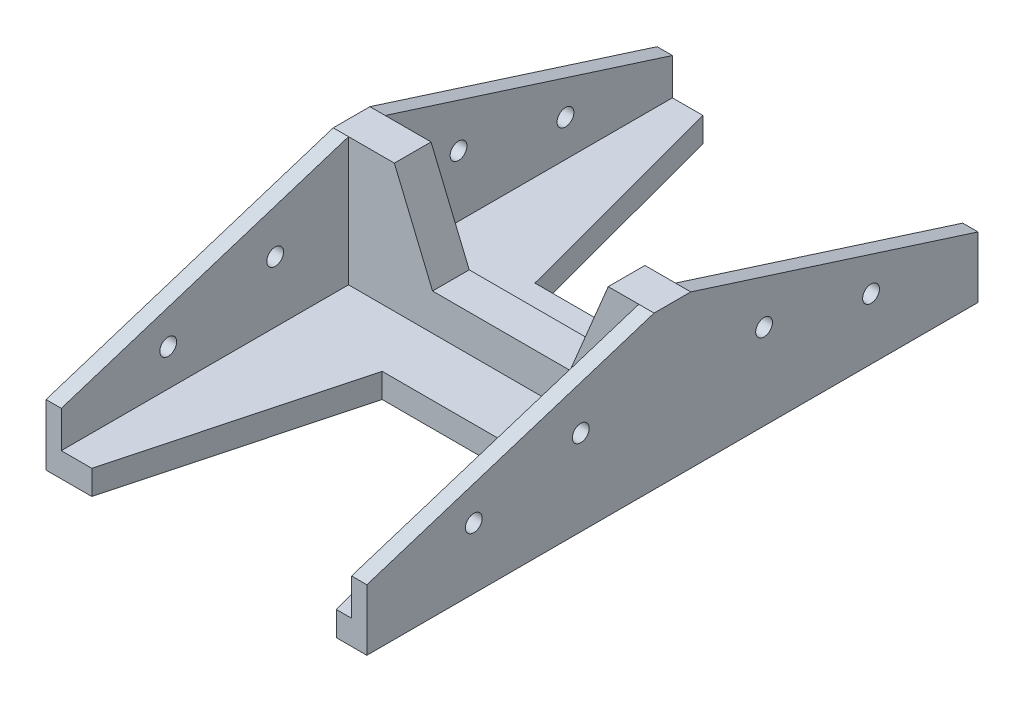
ISO-10303-21;
HEADER;
FILE_DESCRIPTION(('STEP AP214'),'2;1');
FILE_NAME('part.step','',(''),(''),'','','');
FILE_SCHEMA(('AUTOMOTIVE_DESIGN { 1 0 10303 214 1 1 1 1 }'));
ENDSEC;
DATA;
#1=APPLICATION_CONTEXT('core data for automotive mechanical design processes');
#2=APPLICATION_PROTOCOL_DEFINITION('international standard','automotive_design',2000,#1);
#3=PRODUCT_CONTEXT('',#1,'mechanical');
#4=PRODUCT('Part','Part','',(#3));
#5=PRODUCT_RELATED_PRODUCT_CATEGORY('part','',(#4));
#6=PRODUCT_DEFINITION_FORMATION('','',#4);
#7=PRODUCT_DEFINITION_CONTEXT('part definition',#1,'design');
#8=PRODUCT_DEFINITION('design','',#6,#7);
#9=PRODUCT_DEFINITION_SHAPE('','',#8);
#10=(LENGTH_UNIT() NAMED_UNIT(*) SI_UNIT(.MILLI.,.METRE.));
#11=(NAMED_UNIT(*) PLANE_ANGLE_UNIT() SI_UNIT($,.RADIAN.));
#12=(NAMED_UNIT(*) SI_UNIT($,.STERADIAN.) SOLID_ANGLE_UNIT());
#13=UNCERTAINTY_MEASURE_WITH_UNIT(LENGTH_MEASURE(1.E-05),#10,'distance_accuracy_value','');
#14=(GEOMETRIC_REPRESENTATION_CONTEXT(3) GLOBAL_UNCERTAINTY_ASSIGNED_CONTEXT((#13)) GLOBAL_UNIT_ASSIGNED_CONTEXT((#10,
#11,#12)) REPRESENTATION_CONTEXT('',''));
#15=CARTESIAN_POINT('',(0.,0.,0.));
#16=DIRECTION('',(0.,0.,1.));
#17=DIRECTION('',(1.,0.,0.));
#18=AXIS2_PLACEMENT_3D('',#15,#16,#17);
#19=CARTESIAN_POINT('',(5.,30.,6.));
#20=DIRECTION('',(0.,0.,-1.));
#21=DIRECTION('',(0.,1.,0.));
#22=AXIS2_PLACEMENT_3D('',#19,#20,#21);
#23=PLANE('',#22);
#24=DIRECTION('',(0.,1.,0.));
#25=VECTOR('',#24,1.);
#26=CARTESIAN_POINT('',(100.,-12.,6.00000000000001));
#27=LINE('',#26,#25);
#28=CARTESIAN_POINT('',(100.,-12.,6.00000000000001));
#29=VERTEX_POINT('',#28);
#30=CARTESIAN_POINT('',(100.,30.,6.));
#31=VERTEX_POINT('',#30);
#32=EDGE_CURVE('E217',#29,#31,#27,.T.);
#33=ORIENTED_EDGE('',*,*,#32,.T.);
#34=DIRECTION('',(-1.,0.,0.));
#35=VECTOR('',#34,1.);
#36=CARTESIAN_POINT('',(5.,30.,6.));
#37=LINE('',#36,#35);
#38=CARTESIAN_POINT('',(90.,30.,6.));
#39=VERTEX_POINT('',#38);
#40=EDGE_CURVE('E262',#31,#39,#37,.T.);
#41=ORIENTED_EDGE('',*,*,#40,.T.);
#42=DIRECTION('',(0.384615384615384,0.923076923076923,0.));
#43=VECTOR('',#42,1.);
#44=CARTESIAN_POINT('',(90.,30.,6.));
#45=LINE('',#44,#43);
#46=CARTESIAN_POINT('',(77.5,0.,6.));
#47=VERTEX_POINT('',#46);
#48=EDGE_CURVE('E347',#47,#39,#45,.T.);
#49=ORIENTED_EDGE('',*,*,#48,.F.);
#50=DIRECTION('',(1.,0.,0.));
#51=VECTOR('',#50,1.);
#52=CARTESIAN_POINT('',(32.5,0.,6.));
#53=LINE('',#52,#51);
#54=CARTESIAN_POINT('',(32.5,0.,6.));
#55=VERTEX_POINT('',#54);
#56=EDGE_CURVE('E344',#55,#47,#53,.T.);
#57=ORIENTED_EDGE('',*,*,#56,.F.);
#58=DIRECTION('',(0.384615384615385,-0.923076923076923,0.));
#59=VECTOR('',#58,1.);
#60=CARTESIAN_POINT('',(20.,30.,6.));
#61=LINE('',#60,#59);
#62=CARTESIAN_POINT('',(20.,30.,6.));
#63=VERTEX_POINT('',#62);
#64=EDGE_CURVE('E341',#63,#55,#61,.T.);
#65=ORIENTED_EDGE('',*,*,#64,.F.);
#66=CARTESIAN_POINT('',(5.,30.,6.));
#67=VERTEX_POINT('',#66);
#68=EDGE_CURVE('E258',#63,#67,#37,.T.);
#69=ORIENTED_EDGE('',*,*,#68,.T.);
#70=DIRECTION('',(0.,-1.,0.));
#71=VECTOR('',#70,1.);
#72=CARTESIAN_POINT('',(5.,-12.,6.00000000000001));
#73=LINE('',#72,#71);
#74=CARTESIAN_POINT('',(5.,-12.,6.00000000000001));
#75=VERTEX_POINT('',#74);
#76=EDGE_CURVE('E11',#67,#75,#73,.T.);
#77=ORIENTED_EDGE('',*,*,#76,.T.);
#78=DIRECTION('',(-1.,0.,0.));
#79=VECTOR('',#78,1.);
#80=CARTESIAN_POINT('',(105.,-12.,6.00000000000001));
#81=LINE('',#80,#79);
#82=EDGE_CURVE('E431',#29,#75,#81,.T.);
#83=ORIENTED_EDGE('',*,*,#82,.F.);
#84=EDGE_LOOP('',(#33,#41,#49,#57,#65,#69,#77,#83));
#85=FACE_BOUND('',#84,.T.);
#86=ADVANCED_FACE('F34',(#85),#23,.F.);
#87=CARTESIAN_POINT('',(105.,-12.,100.));
#88=DIRECTION('',(0.,-1.,0.));
#89=DIRECTION('',(0.,0.,-1.));
#90=AXIS2_PLACEMENT_3D('',#87,#88,#89);
#91=PLANE('',#90);
#92=DIRECTION('',(0.,0.,-1.));
#93=VECTOR('',#92,1.);
#94=CARTESIAN_POINT('',(100.,-12.,100.));
#95=LINE('',#94,#93);
#96=CARTESIAN_POINT('',(100.,-12.,100.));
#97=VERTEX_POINT('',#96);
#98=EDGE_CURVE('E210',#97,#29,#95,.T.);
#99=ORIENTED_EDGE('',*,*,#98,.T.);
#100=ORIENTED_EDGE('',*,*,#82,.T.);
#101=DIRECTION('',(0.,0.,1.));
#102=VECTOR('',#101,1.);
#103=CARTESIAN_POINT('',(5.,-12.,100.));
#104=LINE('',#103,#102);
#105=CARTESIAN_POINT('',(5.,-12.,100.));
#106=VERTEX_POINT('',#105);
#107=EDGE_CURVE('E419',#75,#106,#104,.T.);
#108=ORIENTED_EDGE('',*,*,#107,.T.);
#109=DIRECTION('',(-1.,0.,0.));
#110=VECTOR('',#109,1.);
#111=CARTESIAN_POINT('',(105.,-12.,100.));
#112=LINE('',#111,#110);
#113=CARTESIAN_POINT('',(15.,-12.,100.));
#114=VERTEX_POINT('',#113);
#115=EDGE_CURVE('E236',#114,#106,#112,.T.);
#116=ORIENTED_EDGE('',*,*,#115,.F.);
#117=DIRECTION('',(-0.257662650560332,0.,0.966234939601246));
#118=VECTOR('',#117,1.);
#119=CARTESIAN_POINT('',(15.,-12.,100.));
#120=LINE('',#119,#118);
#121=CARTESIAN_POINT('',(35.,-12.,25.));
#122=VERTEX_POINT('',#121);
#123=EDGE_CURVE('E392',#122,#114,#120,.T.);
#124=ORIENTED_EDGE('',*,*,#123,.F.);
#125=DIRECTION('',(-1.,0.,0.));
#126=VECTOR('',#125,1.);
#127=CARTESIAN_POINT('',(35.,-12.,25.));
#128=LINE('',#127,#126);
#129=CARTESIAN_POINT('',(75.,-12.,25.));
#130=VERTEX_POINT('',#129);
#131=EDGE_CURVE('E389',#130,#122,#128,.T.);
#132=ORIENTED_EDGE('',*,*,#131,.F.);
#133=DIRECTION('',(-0.257662650560332,0.,-0.966234939601246));
#134=VECTOR('',#133,1.);
#135=CARTESIAN_POINT('',(95.,-12.,100.));
#136=LINE('',#135,#134);
#137=CARTESIAN_POINT('',(95.,-12.,100.));
#138=VERTEX_POINT('',#137);
#139=EDGE_CURVE('E234',#138,#130,#136,.T.);
#140=ORIENTED_EDGE('',*,*,#139,.F.);
#141=EDGE_CURVE('E224',#97,#138,#112,.T.);
#142=ORIENTED_EDGE('',*,*,#141,.F.);
#143=EDGE_LOOP('',(#99,#100,#108,#116,#124,#132,#140,#142));
#144=FACE_BOUND('',#143,.T.);
#145=ADVANCED_FACE('F231',(#144),#91,.F.);
#146=CARTESIAN_POINT('',(5.,30.,-6.));
#147=DIRECTION('',(0.,0.,1.));
#148=DIRECTION('',(0.,-1.,0.));
#149=AXIS2_PLACEMENT_3D('',#146,#147,#148);
#150=PLANE('',#149);
#151=DIRECTION('',(0.,-1.,0.));
#152=VECTOR('',#151,1.);
#153=CARTESIAN_POINT('',(100.,30.,-6.));
#154=LINE('',#153,#152);
#155=CARTESIAN_POINT('',(100.,30.,-6.));
#156=VERTEX_POINT('',#155);
#157=CARTESIAN_POINT('',(100.,-12.,-6.));
#158=VERTEX_POINT('',#157);
#159=EDGE_CURVE('E312',#156,#158,#154,.T.);
#160=ORIENTED_EDGE('',*,*,#159,.T.);
#161=DIRECTION('',(-1.,0.,0.));
#162=VECTOR('',#161,1.);
#163=CARTESIAN_POINT('',(105.,-12.,-6.));
#164=LINE('',#163,#162);
#165=CARTESIAN_POINT('',(5.,-12.,-6.));
#166=VERTEX_POINT('',#165);
#167=EDGE_CURVE('E438',#158,#166,#164,.T.);
#168=ORIENTED_EDGE('',*,*,#167,.T.);
#169=DIRECTION('',(0.,1.,0.));
#170=VECTOR('',#169,1.);
#171=CARTESIAN_POINT('',(5.,30.,-6.));
#172=LINE('',#171,#170);
#173=CARTESIAN_POINT('',(5.,30.,-6.));
#174=VERTEX_POINT('',#173);
#175=EDGE_CURVE('E51',#166,#174,#172,.T.);
#176=ORIENTED_EDGE('',*,*,#175,.T.);
#177=DIRECTION('',(-1.,0.,0.));
#178=VECTOR('',#177,1.);
#179=CARTESIAN_POINT('',(5.,30.,-6.));
#180=LINE('',#179,#178);
#181=CARTESIAN_POINT('',(20.,30.,-5.99999999999999));
#182=VERTEX_POINT('',#181);
#183=EDGE_CURVE('E261',#182,#174,#180,.T.);
#184=ORIENTED_EDGE('',*,*,#183,.F.);
#185=DIRECTION('',(0.384615384615385,-0.923076923076923,0.));
#186=VECTOR('',#185,1.);
#187=CARTESIAN_POINT('',(17.7810650887574,35.3254437869822,-6.));
#188=LINE('',#187,#186);
#189=CARTESIAN_POINT('',(32.5,0.,-6.00000000000001));
#190=VERTEX_POINT('',#189);
#191=EDGE_CURVE('E354',#182,#190,#188,.T.);
#192=ORIENTED_EDGE('',*,*,#191,.T.);
#193=DIRECTION('',(1.,0.,0.));
#194=VECTOR('',#193,1.);
#195=CARTESIAN_POINT('',(5.,0.,-6.));
#196=LINE('',#195,#194);
#197=CARTESIAN_POINT('',(77.5,0.,-6.00000000000001));
#198=VERTEX_POINT('',#197);
#199=EDGE_CURVE('E362',#190,#198,#196,.T.);
#200=ORIENTED_EDGE('',*,*,#199,.T.);
#201=DIRECTION('',(0.384615384615384,0.923076923076923,0.));
#202=VECTOR('',#201,1.);
#203=CARTESIAN_POINT('',(77.4260355029586,-0.177514792899403,-6.));
#204=LINE('',#203,#202);
#205=CARTESIAN_POINT('',(90.,30.,-5.99999999999999));
#206=VERTEX_POINT('',#205);
#207=EDGE_CURVE('E365',#198,#206,#204,.T.);
#208=ORIENTED_EDGE('',*,*,#207,.T.);
#209=EDGE_CURVE('E267',#156,#206,#180,.T.);
#210=ORIENTED_EDGE('',*,*,#209,.F.);
#211=EDGE_LOOP('',(#160,#168,#176,#184,#192,#200,#208,#210));
#212=FACE_BOUND('',#211,.T.);
#213=ADVANCED_FACE('F514',(#212),#150,.F.);
#214=CARTESIAN_POINT('',(105.,-12.,-6.));
#215=DIRECTION('',(0.,-1.,0.));
#216=DIRECTION('',(0.,0.,-1.));
#217=AXIS2_PLACEMENT_3D('',#214,#215,#216);
#218=PLANE('',#217);
#219=DIRECTION('',(0.,0.,-1.));
#220=VECTOR('',#219,1.);
#221=CARTESIAN_POINT('',(100.,-12.,-6.));
#222=LINE('',#221,#220);
#223=CARTESIAN_POINT('',(100.,-12.,-100.));
#224=VERTEX_POINT('',#223);
#225=EDGE_CURVE('E315',#158,#224,#222,.T.);
#226=ORIENTED_EDGE('',*,*,#225,.T.);
#227=DIRECTION('',(-1.,0.,0.));
#228=VECTOR('',#227,1.);
#229=CARTESIAN_POINT('',(105.,-12.,-100.));
#230=LINE('',#229,#228);
#231=CARTESIAN_POINT('',(95.,-12.,-100.));
#232=VERTEX_POINT('',#231);
#233=EDGE_CURVE('E241',#224,#232,#230,.T.);
#234=ORIENTED_EDGE('',*,*,#233,.T.);
#235=DIRECTION('',(0.257662650560332,0.,-0.966234939601246));
#236=VECTOR('',#235,1.);
#237=CARTESIAN_POINT('',(95.,-12.,-100.));
#238=LINE('',#237,#236);
#239=CARTESIAN_POINT('',(75.,-12.,-25.));
#240=VERTEX_POINT('',#239);
#241=EDGE_CURVE('E375',#240,#232,#238,.T.);
#242=ORIENTED_EDGE('',*,*,#241,.F.);
#243=DIRECTION('',(1.,0.,0.));
#244=VECTOR('',#243,1.);
#245=CARTESIAN_POINT('',(35.,-12.,-25.));
#246=LINE('',#245,#244);
#247=CARTESIAN_POINT('',(35.,-12.,-25.));
#248=VERTEX_POINT('',#247);
#249=EDGE_CURVE('E371',#248,#240,#246,.T.);
#250=ORIENTED_EDGE('',*,*,#249,.F.);
#251=DIRECTION('',(0.257662650560332,0.,0.966234939601246));
#252=VECTOR('',#251,1.);
#253=CARTESIAN_POINT('',(15.,-12.,-100.));
#254=LINE('',#253,#252);
#255=CARTESIAN_POINT('',(15.,-12.,-100.));
#256=VERTEX_POINT('',#255);
#257=EDGE_CURVE('E368',#256,#248,#254,.T.);
#258=ORIENTED_EDGE('',*,*,#257,.F.);
#259=CARTESIAN_POINT('',(5.,-12.,-100.));
#260=VERTEX_POINT('',#259);
#261=EDGE_CURVE('E439',#256,#260,#230,.T.);
#262=ORIENTED_EDGE('',*,*,#261,.T.);
#263=DIRECTION('',(0.,0.,1.));
#264=VECTOR('',#263,1.);
#265=CARTESIAN_POINT('',(5.,-12.,-6.));
#266=LINE('',#265,#264);
#267=EDGE_CURVE('E434',#260,#166,#266,.T.);
#268=ORIENTED_EDGE('',*,*,#267,.T.);
#269=ORIENTED_EDGE('',*,*,#167,.F.);
#270=EDGE_LOOP('',(#226,#234,#242,#250,#258,#262,#268,#269));
#271=FACE_BOUND('',#270,.T.);
#272=ADVANCED_FACE('F447',(#271),#218,.F.);
#273=CARTESIAN_POINT('',(5.,30.,6.));
#274=DIRECTION('',(0.,-1.,0.));
#275=DIRECTION('',(0.,0.,-1.));
#276=AXIS2_PLACEMENT_3D('',#273,#274,#275);
#277=PLANE('',#276);
#278=CARTESIAN_POINT('',(105.,30.,-6.));
#279=VERTEX_POINT('',#278);
#280=EDGE_CURVE('E263',#279,#156,#180,.T.);
#281=ORIENTED_EDGE('',*,*,#280,.T.);
#282=ORIENTED_EDGE('',*,*,#209,.T.);
#283=DIRECTION('',(0.,0.,1.));
#284=VECTOR('',#283,1.);
#285=CARTESIAN_POINT('',(90.,30.,-94.));
#286=LINE('',#285,#284);
#287=EDGE_CURVE('E351',#206,#39,#286,.T.);
#288=ORIENTED_EDGE('',*,*,#287,.T.);
#289=ORIENTED_EDGE('',*,*,#40,.F.);
#290=CARTESIAN_POINT('',(105.,30.,6.));
#291=VERTEX_POINT('',#290);
#292=EDGE_CURVE('E259',#291,#31,#37,.T.);
#293=ORIENTED_EDGE('',*,*,#292,.F.);
#294=DIRECTION('',(0.,0.,1.));
#295=VECTOR('',#294,1.);
#296=CARTESIAN_POINT('',(105.,30.,6.));
#297=LINE('',#296,#295);
#298=EDGE_CURVE('E428',#279,#291,#297,.T.);
#299=ORIENTED_EDGE('',*,*,#298,.F.);
#300=EDGE_LOOP('',(#281,#282,#288,#289,#293,#299));
#301=FACE_BOUND('',#300,.T.);
#302=ADVANCED_FACE('F467',(#301),#277,.F.);
#303=CARTESIAN_POINT('',(5.,0.,100.));
#304=DIRECTION('',(0.,0.,-1.));
#305=DIRECTION('',(-1.,0.,0.));
#306=AXIS2_PLACEMENT_3D('',#303,#304,#305);
#307=PLANE('',#306);
#308=DIRECTION('',(-1.,0.,0.));
#309=VECTOR('',#308,1.);
#310=CARTESIAN_POINT('',(5.,-20.,100.));
#311=LINE('',#310,#309);
#312=CARTESIAN_POINT('',(15.,-20.,100.));
#313=VERTEX_POINT('',#312);
#314=CARTESIAN_POINT('',(0.,-20.,100.));
#315=VERTEX_POINT('',#314);
#316=EDGE_CURVE('E274',#313,#315,#311,.T.);
#317=ORIENTED_EDGE('',*,*,#316,.F.);
#318=DIRECTION('',(0.,1.,0.));
#319=VECTOR('',#318,1.);
#320=CARTESIAN_POINT('',(15.,-112.,100.));
#321=LINE('',#320,#319);
#322=EDGE_CURVE('E372',#313,#114,#321,.T.);
#323=ORIENTED_EDGE('',*,*,#322,.T.);
#324=ORIENTED_EDGE('',*,*,#115,.T.);
#325=DIRECTION('',(0.,-1.,0.));
#326=VECTOR('',#325,1.);
#327=CARTESIAN_POINT('',(5.,0.,100.));
#328=LINE('',#327,#326);
#329=CARTESIAN_POINT('',(5.,0.,100.));
#330=VERTEX_POINT('',#329);
#331=EDGE_CURVE('E245',#330,#106,#328,.T.);
#332=ORIENTED_EDGE('',*,*,#331,.F.);
#333=DIRECTION('',(-1.,0.,0.));
#334=VECTOR('',#333,1.);
#335=CARTESIAN_POINT('',(5.,0.,100.));
#336=LINE('',#335,#334);
#337=CARTESIAN_POINT('',(0.,0.,100.));
#338=VERTEX_POINT('',#337);
#339=EDGE_CURVE('E250',#330,#338,#336,.T.);
#340=ORIENTED_EDGE('',*,*,#339,.T.);
#341=DIRECTION('',(0.,-1.,0.));
#342=VECTOR('',#341,1.);
#343=CARTESIAN_POINT('',(0.,0.,100.));
#344=LINE('',#343,#342);
#345=EDGE_CURVE('E235',#338,#315,#344,.T.);
#346=ORIENTED_EDGE('',*,*,#345,.T.);
#347=EDGE_LOOP('',(#317,#323,#324,#332,#340,#346));
#348=FACE_BOUND('',#347,.T.);
#349=ADVANCED_FACE('F487',(#348),#307,.F.);
#350=CARTESIAN_POINT('',(5.,0.,-100.));
#351=DIRECTION('',(0.,0.,1.));
#352=DIRECTION('',(1.,0.,0.));
#353=AXIS2_PLACEMENT_3D('',#350,#351,#352);
#354=PLANE('',#353);
#355=DIRECTION('',(-1.,0.,0.));
#356=VECTOR('',#355,1.);
#357=CARTESIAN_POINT('',(5.,-20.,-100.));
#358=LINE('',#357,#356);
#359=CARTESIAN_POINT('',(105.,-20.,-100.));
#360=VERTEX_POINT('',#359);
#361=CARTESIAN_POINT('',(95.,-20.,-100.));
#362=VERTEX_POINT('',#361);
#363=EDGE_CURVE('E271',#360,#362,#358,.T.);
#364=ORIENTED_EDGE('',*,*,#363,.T.);
#365=DIRECTION('',(0.,1.,0.));
#366=VECTOR('',#365,1.);
#367=CARTESIAN_POINT('',(95.,-112.,-100.));
#368=LINE('',#367,#366);
#369=EDGE_CURVE('E379',#362,#232,#368,.T.);
#370=ORIENTED_EDGE('',*,*,#369,.T.);
#371=ORIENTED_EDGE('',*,*,#233,.F.);
#372=DIRECTION('',(0.,1.,0.));
#373=VECTOR('',#372,1.);
#374=CARTESIAN_POINT('',(100.,-12.,-100.));
#375=LINE('',#374,#373);
#376=CARTESIAN_POINT('',(100.,0.,-100.));
#377=VERTEX_POINT('',#376);
#378=EDGE_CURVE('E318',#224,#377,#375,.T.);
#379=ORIENTED_EDGE('',*,*,#378,.T.);
#380=DIRECTION('',(1.,0.,0.));
#381=VECTOR('',#380,1.);
#382=CARTESIAN_POINT('',(100.,0.,-100.));
#383=LINE('',#382,#381);
#384=CARTESIAN_POINT('',(105.,0.,-100.));
#385=VERTEX_POINT('',#384);
#386=EDGE_CURVE('E321',#377,#385,#383,.T.);
#387=ORIENTED_EDGE('',*,*,#386,.T.);
#388=DIRECTION('',(0.,1.,0.));
#389=VECTOR('',#388,1.);
#390=CARTESIAN_POINT('',(105.,-12.,-100.));
#391=LINE('',#390,#389);
#392=EDGE_CURVE('E426',#360,#385,#391,.T.);
#393=ORIENTED_EDGE('',*,*,#392,.F.);
#394=EDGE_LOOP('',(#364,#370,#371,#379,#387,#393));
#395=FACE_BOUND('',#394,.T.);
#396=ADVANCED_FACE('F453',(#395),#354,.F.);
#397=CARTESIAN_POINT('',(5.,0.,0.));
#398=DIRECTION('',(1.,0.,0.));
#399=DIRECTION('',(0.,0.,-1.));
#400=AXIS2_PLACEMENT_3D('',#397,#398,#399);
#401=PLANE('',#400);
#402=CARTESIAN_POINT('',(5.,8.,30.));
#403=DIRECTION('',(1.,0.,0.));
#404=DIRECTION('',(0.,0.,-1.));
#405=AXIS2_PLACEMENT_3D('',#402,#403,#404);
#406=CIRCLE('',#405,2.75);
#407=CARTESIAN_POINT('',(5.,8.,27.25));
#408=VERTEX_POINT('',#407);
#409=EDGE_CURVE('E284',#408,#408,#406,.T.);
#410=ORIENTED_EDGE('',*,*,#409,.F.);
#411=EDGE_LOOP('',(#410));
#412=FACE_BOUND('',#411,.T.);
#413=CARTESIAN_POINT('',(5.,0.,65.));
#414=DIRECTION('',(1.,0.,0.));
#415=DIRECTION('',(0.,0.,-1.));
#416=AXIS2_PLACEMENT_3D('',#413,#414,#415);
#417=CIRCLE('',#416,2.75000000000001);
#418=CARTESIAN_POINT('',(5.,0.,62.25));
#419=VERTEX_POINT('',#418);
#420=EDGE_CURVE('E280',#419,#419,#417,.T.);
#421=ORIENTED_EDGE('',*,*,#420,.F.);
#422=EDGE_LOOP('',(#421));
#423=FACE_BOUND('',#422,.T.);
#424=ORIENTED_EDGE('',*,*,#107,.F.);
#425=ORIENTED_EDGE('',*,*,#76,.F.);
#426=DIRECTION('',(0.,-0.304040173793197,0.952659211218683));
#427=VECTOR('',#426,1.);
#428=CARTESIAN_POINT('',(5.,0.,100.));
#429=LINE('',#428,#427);
#430=EDGE_CURVE('E334',#67,#330,#429,.T.);
#431=ORIENTED_EDGE('',*,*,#430,.T.);
#432=ORIENTED_EDGE('',*,*,#331,.T.);
#433=EDGE_LOOP('',(#424,#425,#431,#432));
#434=FACE_BOUND('',#433,.T.);
#435=ADVANCED_FACE('F482',(#412,#423,#434),#401,.T.);
#436=DIRECTION('',(0.,-1.,0.));
#437=VECTOR('',#436,1.);
#438=CARTESIAN_POINT('',(105.,-20.,100.));
#439=LINE('',#438,#437);
#440=CARTESIAN_POINT('',(105.,0.,100.));
#441=VERTEX_POINT('',#440);
#442=CARTESIAN_POINT('',(105.,-20.,100.));
#443=VERTEX_POINT('',#442);
#444=EDGE_CURVE('E420',#441,#443,#439,.T.);
#445=ORIENTED_EDGE('',*,*,#444,.F.);
#446=DIRECTION('',(1.,0.,0.));
#447=VECTOR('',#446,1.);
#448=CARTESIAN_POINT('',(100.,0.,100.));
#449=LINE('',#448,#447);
#450=CARTESIAN_POINT('',(100.,0.,100.));
#451=VERTEX_POINT('',#450);
#452=EDGE_CURVE('E227',#451,#441,#449,.T.);
#453=ORIENTED_EDGE('',*,*,#452,.F.);
#454=DIRECTION('',(0.,-1.,0.));
#455=VECTOR('',#454,1.);
#456=CARTESIAN_POINT('',(100.,0.,100.));
#457=LINE('',#456,#455);
#458=EDGE_CURVE('E214',#451,#97,#457,.T.);
#459=ORIENTED_EDGE('',*,*,#458,.T.);
#460=ORIENTED_EDGE('',*,*,#141,.T.);
#461=DIRECTION('',(0.,1.,0.));
#462=VECTOR('',#461,1.);
#463=CARTESIAN_POINT('',(95.,-112.,100.));
#464=LINE('',#463,#462);
#465=CARTESIAN_POINT('',(95.,-20.,100.));
#466=VERTEX_POINT('',#465);
#467=EDGE_CURVE('E394',#466,#138,#464,.T.);
#468=ORIENTED_EDGE('',*,*,#467,.F.);
#469=EDGE_CURVE('E43',#443,#466,#311,.T.);
#470=ORIENTED_EDGE('',*,*,#469,.F.);
#471=EDGE_LOOP('',(#445,#453,#459,#460,#468,#470));
#472=FACE_BOUND('',#471,.T.);
#473=ADVANCED_FACE('F36',(#472),#307,.F.);
#474=CARTESIAN_POINT('',(5.,-20.,100.));
#475=DIRECTION('',(0.,1.,0.));
#476=DIRECTION('',(0.,0.,1.));
#477=AXIS2_PLACEMENT_3D('',#474,#475,#476);
#478=PLANE('',#477);
#479=DIRECTION('',(1.,0.,0.));
#480=VECTOR('',#479,1.);
#481=CARTESIAN_POINT('',(5.,-20.,-25.));
#482=LINE('',#481,#480);
#483=CARTESIAN_POINT('',(35.,-20.,-25.));
#484=VERTEX_POINT('',#483);
#485=CARTESIAN_POINT('',(75.,-20.,-25.));
#486=VERTEX_POINT('',#485);
#487=EDGE_CURVE('E404',#484,#486,#482,.T.);
#488=ORIENTED_EDGE('',*,*,#487,.T.);
#489=DIRECTION('',(0.257662650560332,0.,-0.966234939601246));
#490=VECTOR('',#489,1.);
#491=CARTESIAN_POINT('',(39.2323651452282,-20.,109.128630705394));
#492=LINE('',#491,#490);
#493=EDGE_CURVE('E407',#486,#362,#492,.T.);
#494=ORIENTED_EDGE('',*,*,#493,.T.);
#495=ORIENTED_EDGE('',*,*,#363,.F.);
#496=DIRECTION('',(0.,0.,-1.));
#497=VECTOR('',#496,1.);
#498=CARTESIAN_POINT('',(105.,-20.,-100.));
#499=LINE('',#498,#497);
#500=EDGE_CURVE('E423',#443,#360,#499,.T.);
#501=ORIENTED_EDGE('',*,*,#500,.F.);
#502=ORIENTED_EDGE('',*,*,#469,.T.);
#503=DIRECTION('',(-0.257662650560332,0.,-0.966234939601246));
#504=VECTOR('',#503,1.);
#505=CARTESIAN_POINT('',(89.0248962655602,-20.,77.5933609958506));
#506=LINE('',#505,#504);
#507=CARTESIAN_POINT('',(75.,-20.,25.));
#508=VERTEX_POINT('',#507);
#509=EDGE_CURVE('E410',#466,#508,#506,.T.);
#510=ORIENTED_EDGE('',*,*,#509,.T.);
#511=DIRECTION('',(-1.,0.,0.));
#512=VECTOR('',#511,1.);
#513=CARTESIAN_POINT('',(5.,-20.,25.));
#514=LINE('',#513,#512);
#515=CARTESIAN_POINT('',(35.,-20.,25.));
#516=VERTEX_POINT('',#515);
#517=EDGE_CURVE('E413',#508,#516,#514,.T.);
#518=ORIENTED_EDGE('',*,*,#517,.T.);
#519=DIRECTION('',(-0.257662650560332,0.,0.966234939601246));
#520=VECTOR('',#519,1.);
#521=CARTESIAN_POINT('',(14.3360995850623,-20.,102.489626556017));
#522=LINE('',#521,#520);
#523=EDGE_CURVE('E416',#516,#313,#522,.T.);
#524=ORIENTED_EDGE('',*,*,#523,.T.);
#525=ORIENTED_EDGE('',*,*,#316,.T.);
#526=DIRECTION('',(0.,0.,-1.));
#527=VECTOR('',#526,1.);
#528=CARTESIAN_POINT('',(0.,-20.,100.));
#529=LINE('',#528,#527);
#530=CARTESIAN_POINT('',(0.,-20.,-100.));
#531=VERTEX_POINT('',#530);
#532=EDGE_CURVE('E239',#315,#531,#529,.T.);
#533=ORIENTED_EDGE('',*,*,#532,.T.);
#534=CARTESIAN_POINT('',(15.,-20.,-100.));
#535=VERTEX_POINT('',#534);
#536=EDGE_CURVE('E270',#535,#531,#358,.T.);
#537=ORIENTED_EDGE('',*,*,#536,.F.);
#538=DIRECTION('',(0.257662650560332,0.,0.966234939601246));
#539=VECTOR('',#538,1.);
#540=CARTESIAN_POINT('',(64.1286307053942,-20.,84.2323651452282));
#541=LINE('',#540,#539);
#542=EDGE_CURVE('E382',#535,#484,#541,.T.);
#543=ORIENTED_EDGE('',*,*,#542,.T.);
#544=EDGE_LOOP('',(#488,#494,#495,#501,#502,#510,#518,#524,#525,#533,#537,#543));
#545=FACE_BOUND('',#544,.T.);
#546=ADVANCED_FACE('F457',(#545),#478,.F.);
#547=ORIENTED_EDGE('',*,*,#261,.F.);
#548=DIRECTION('',(0.,1.,0.));
#549=VECTOR('',#548,1.);
#550=CARTESIAN_POINT('',(15.,-112.,-100.));
#551=LINE('',#550,#549);
#552=EDGE_CURVE('E378',#535,#256,#551,.T.);
#553=ORIENTED_EDGE('',*,*,#552,.F.);
#554=ORIENTED_EDGE('',*,*,#536,.T.);
#555=DIRECTION('',(0.,1.,0.));
#556=VECTOR('',#555,1.);
#557=CARTESIAN_POINT('',(0.,0.,-100.));
#558=LINE('',#557,#556);
#559=CARTESIAN_POINT('',(0.,0.,-100.));
#560=VERTEX_POINT('',#559);
#561=EDGE_CURVE('E254',#531,#560,#558,.T.);
#562=ORIENTED_EDGE('',*,*,#561,.T.);
#563=DIRECTION('',(-1.,0.,0.));
#564=VECTOR('',#563,1.);
#565=CARTESIAN_POINT('',(5.,0.,-100.));
#566=LINE('',#565,#564);
#567=CARTESIAN_POINT('',(5.,0.,-100.));
#568=VERTEX_POINT('',#567);
#569=EDGE_CURVE('E266',#568,#560,#566,.T.);
#570=ORIENTED_EDGE('',*,*,#569,.F.);
#571=DIRECTION('',(0.,1.,0.));
#572=VECTOR('',#571,1.);
#573=CARTESIAN_POINT('',(5.,0.,-100.));
#574=LINE('',#573,#572);
#575=EDGE_CURVE('E248',#260,#568,#574,.T.);
#576=ORIENTED_EDGE('',*,*,#575,.F.);
#577=EDGE_LOOP('',(#547,#553,#554,#562,#570,#576));
#578=FACE_BOUND('',#577,.T.);
#579=ADVANCED_FACE('F524',(#578),#354,.F.);
#580=ORIENTED_EDGE('',*,*,#68,.F.);
#581=DIRECTION('',(0.,0.,1.));
#582=VECTOR('',#581,1.);
#583=CARTESIAN_POINT('',(20.,30.,-94.));
#584=LINE('',#583,#582);
#585=EDGE_CURVE('E350',#182,#63,#584,.T.);
#586=ORIENTED_EDGE('',*,*,#585,.F.);
#587=ORIENTED_EDGE('',*,*,#183,.T.);
#588=DIRECTION('',(1.,0.,0.));
#589=VECTOR('',#588,1.);
#590=CARTESIAN_POINT('',(0.,30.,-6.));
#591=LINE('',#590,#589);
#592=CARTESIAN_POINT('',(0.,30.,-6.));
#593=VERTEX_POINT('',#592);
#594=EDGE_CURVE('E329',#593,#174,#591,.T.);
#595=ORIENTED_EDGE('',*,*,#594,.F.);
#596=DIRECTION('',(0.,0.,1.));
#597=VECTOR('',#596,1.);
#598=CARTESIAN_POINT('',(0.,30.,6.));
#599=LINE('',#598,#597);
#600=CARTESIAN_POINT('',(0.,30.,6.));
#601=VERTEX_POINT('',#600);
#602=EDGE_CURVE('E249',#593,#601,#599,.T.);
#603=ORIENTED_EDGE('',*,*,#602,.T.);
#604=DIRECTION('',(1.,0.,0.));
#605=VECTOR('',#604,1.);
#606=CARTESIAN_POINT('',(0.,30.,6.));
#607=LINE('',#606,#605);
#608=EDGE_CURVE('E338',#601,#67,#607,.T.);
#609=ORIENTED_EDGE('',*,*,#608,.T.);
#610=EDGE_LOOP('',(#580,#586,#587,#595,#603,#609));
#611=FACE_BOUND('',#610,.T.);
#612=ADVANCED_FACE('F520',(#611),#277,.F.);
#613=CARTESIAN_POINT('',(5.,0.,-65.));
#614=DIRECTION('',(1.,0.,0.));
#615=DIRECTION('',(0.,0.,-1.));
#616=AXIS2_PLACEMENT_3D('',#613,#614,#615);
#617=CIRCLE('',#616,2.75000000000001);
#618=CARTESIAN_POINT('',(5.,0.,-67.75));
#619=VERTEX_POINT('',#618);
#620=EDGE_CURVE('E299',#619,#619,#617,.T.);
#621=ORIENTED_EDGE('',*,*,#620,.F.);
#622=EDGE_LOOP('',(#621));
#623=FACE_BOUND('',#622,.T.);
#624=CARTESIAN_POINT('',(5.,8.,-30.));
#625=DIRECTION('',(1.,0.,0.));
#626=DIRECTION('',(0.,0.,-1.));
#627=AXIS2_PLACEMENT_3D('',#624,#625,#626);
#628=CIRCLE('',#627,2.75);
#629=CARTESIAN_POINT('',(5.,8.,-32.75));
#630=VERTEX_POINT('',#629);
#631=EDGE_CURVE('E287',#630,#630,#628,.T.);
#632=ORIENTED_EDGE('',*,*,#631,.F.);
#633=EDGE_LOOP('',(#632));
#634=FACE_BOUND('',#633,.T.);
#635=ORIENTED_EDGE('',*,*,#175,.F.);
#636=ORIENTED_EDGE('',*,*,#267,.F.);
#637=ORIENTED_EDGE('',*,*,#575,.T.);
#638=DIRECTION('',(0.,0.304040173793197,0.952659211218683));
#639=VECTOR('',#638,1.);
#640=CARTESIAN_POINT('',(5.,0.,-100.));
#641=LINE('',#640,#639);
#642=EDGE_CURVE('E325',#568,#174,#641,.T.);
#643=ORIENTED_EDGE('',*,*,#642,.T.);
#644=EDGE_LOOP('',(#635,#636,#637,#643));
#645=FACE_BOUND('',#644,.T.);
#646=ADVANCED_FACE('F523',(#623,#634,#645),#401,.T.);
#647=CARTESIAN_POINT('',(0.,0.,0.));
#648=DIRECTION('',(1.,0.,0.));
#649=DIRECTION('',(0.,0.,-1.));
#650=AXIS2_PLACEMENT_3D('',#647,#648,#649);
#651=PLANE('',#650);
#652=CARTESIAN_POINT('',(0.,8.,30.));
#653=DIRECTION('',(1.,0.,0.));
#654=DIRECTION('',(0.,0.,1.));
#655=AXIS2_PLACEMENT_3D('',#652,#653,#654);
#656=CIRCLE('',#655,2.75);
#657=CARTESIAN_POINT('',(0.,8.,32.75));
#658=VERTEX_POINT('',#657);
#659=EDGE_CURVE('E846',#658,#658,#656,.T.);
#660=ORIENTED_EDGE('',*,*,#659,.T.);
#661=EDGE_LOOP('',(#660));
#662=FACE_BOUND('',#661,.T.);
#663=CARTESIAN_POINT('',(0.,0.,65.));
#664=DIRECTION('',(1.,0.,0.));
#665=DIRECTION('',(0.,0.,1.));
#666=AXIS2_PLACEMENT_3D('',#663,#664,#665);
#667=CIRCLE('',#666,2.75000000000001);
#668=CARTESIAN_POINT('',(0.,0.,67.75));
#669=VERTEX_POINT('',#668);
#670=EDGE_CURVE('E851',#669,#669,#667,.T.);
#671=ORIENTED_EDGE('',*,*,#670,.T.);
#672=EDGE_LOOP('',(#671));
#673=FACE_BOUND('',#672,.T.);
#674=CARTESIAN_POINT('',(0.,0.,-65.));
#675=DIRECTION('',(1.,0.,0.));
#676=DIRECTION('',(0.,0.,-1.));
#677=AXIS2_PLACEMENT_3D('',#674,#675,#676);
#678=CIRCLE('',#677,2.75000000000001);
#679=CARTESIAN_POINT('',(0.,0.,-67.75));
#680=VERTEX_POINT('',#679);
#681=EDGE_CURVE('E860',#680,#680,#678,.T.);
#682=ORIENTED_EDGE('',*,*,#681,.T.);
#683=EDGE_LOOP('',(#682));
#684=FACE_BOUND('',#683,.T.);
#685=CARTESIAN_POINT('',(0.,8.,-30.));
#686=DIRECTION('',(1.,0.,0.));
#687=DIRECTION('',(0.,0.,-1.));
#688=AXIS2_PLACEMENT_3D('',#685,#686,#687);
#689=CIRCLE('',#688,2.75);
#690=CARTESIAN_POINT('',(0.,8.,-32.75));
#691=VERTEX_POINT('',#690);
#692=EDGE_CURVE('E281',#691,#691,#689,.T.);
#693=ORIENTED_EDGE('',*,*,#692,.T.);
#694=EDGE_LOOP('',(#693));
#695=FACE_BOUND('',#694,.T.);
#696=ORIENTED_EDGE('',*,*,#602,.F.);
#697=DIRECTION('',(0.,0.304040173793197,0.952659211218683));
#698=VECTOR('',#697,1.);
#699=CARTESIAN_POINT('',(0.,0.,-100.));
#700=LINE('',#699,#698);
#701=EDGE_CURVE('E326',#560,#593,#700,.T.);
#702=ORIENTED_EDGE('',*,*,#701,.F.);
#703=ORIENTED_EDGE('',*,*,#561,.F.);
#704=ORIENTED_EDGE('',*,*,#532,.F.);
#705=ORIENTED_EDGE('',*,*,#345,.F.);
#706=DIRECTION('',(0.,-0.304040173793197,0.952659211218683));
#707=VECTOR('',#706,1.);
#708=CARTESIAN_POINT('',(0.,0.,100.));
#709=LINE('',#708,#707);
#710=EDGE_CURVE('E335',#601,#338,#709,.T.);
#711=ORIENTED_EDGE('',*,*,#710,.F.);
#712=EDGE_LOOP('',(#696,#702,#703,#704,#705,#711));
#713=FACE_BOUND('',#712,.T.);
#714=ADVANCED_FACE('F518',(#662,#673,#684,#695,#713),#651,.F.);
#715=CARTESIAN_POINT('',(105.,0.,0.));
#716=DIRECTION('',(1.,0.,0.));
#717=DIRECTION('',(0.,0.,-1.));
#718=AXIS2_PLACEMENT_3D('',#715,#716,#717);
#719=PLANE('',#718);
#720=CARTESIAN_POINT('',(105.,8.,30.));
#721=DIRECTION('',(1.,0.,0.));
#722=DIRECTION('',(0.,0.,1.));
#723=AXIS2_PLACEMENT_3D('',#720,#721,#722);
#724=CIRCLE('',#723,2.75);
#725=CARTESIAN_POINT('',(105.,8.,32.75));
#726=VERTEX_POINT('',#725);
#727=EDGE_CURVE('E848',#726,#726,#724,.T.);
#728=ORIENTED_EDGE('',*,*,#727,.F.);
#729=EDGE_LOOP('',(#728));
#730=FACE_BOUND('',#729,.T.);
#731=CARTESIAN_POINT('',(105.,0.,65.));
#732=DIRECTION('',(1.,0.,0.));
#733=DIRECTION('',(0.,0.,1.));
#734=AXIS2_PLACEMENT_3D('',#731,#732,#733);
#735=CIRCLE('',#734,2.75000000000001);
#736=CARTESIAN_POINT('',(105.,0.,67.75));
#737=VERTEX_POINT('',#736);
#738=EDGE_CURVE('E847',#737,#737,#735,.T.);
#739=ORIENTED_EDGE('',*,*,#738,.F.);
#740=EDGE_LOOP('',(#739));
#741=FACE_BOUND('',#740,.T.);
#742=CARTESIAN_POINT('',(105.,0.,-65.));
#743=DIRECTION('',(1.,0.,0.));
#744=DIRECTION('',(0.,0.,-1.));
#745=AXIS2_PLACEMENT_3D('',#742,#743,#744);
#746=CIRCLE('',#745,2.75000000000001);
#747=CARTESIAN_POINT('',(105.,0.,-67.75));
#748=VERTEX_POINT('',#747);
#749=EDGE_CURVE('E863',#748,#748,#746,.T.);
#750=ORIENTED_EDGE('',*,*,#749,.F.);
#751=EDGE_LOOP('',(#750));
#752=FACE_BOUND('',#751,.T.);
#753=CARTESIAN_POINT('',(105.,8.,-30.));
#754=DIRECTION('',(1.,0.,0.));
#755=DIRECTION('',(0.,0.,-1.));
#756=AXIS2_PLACEMENT_3D('',#753,#754,#755);
#757=CIRCLE('',#756,2.75);
#758=CARTESIAN_POINT('',(105.,8.,-32.75));
#759=VERTEX_POINT('',#758);
#760=EDGE_CURVE('E858',#759,#759,#757,.T.);
#761=ORIENTED_EDGE('',*,*,#760,.F.);
#762=EDGE_LOOP('',(#761));
#763=FACE_BOUND('',#762,.T.);
#764=ORIENTED_EDGE('',*,*,#298,.T.);
#765=DIRECTION('',(0.,-0.304040173793197,0.952659211218683));
#766=VECTOR('',#765,1.);
#767=CARTESIAN_POINT('',(105.,30.,6.));
#768=LINE('',#767,#766);
#769=EDGE_CURVE('E228',#291,#441,#768,.T.);
#770=ORIENTED_EDGE('',*,*,#769,.T.);
#771=ORIENTED_EDGE('',*,*,#444,.T.);
#772=ORIENTED_EDGE('',*,*,#500,.T.);
#773=ORIENTED_EDGE('',*,*,#392,.T.);
#774=DIRECTION('',(0.,0.304040173793197,0.952659211218683));
#775=VECTOR('',#774,1.);
#776=CARTESIAN_POINT('',(105.,0.,-100.));
#777=LINE('',#776,#775);
#778=EDGE_CURVE('E308',#385,#279,#777,.T.);
#779=ORIENTED_EDGE('',*,*,#778,.T.);
#780=EDGE_LOOP('',(#764,#770,#771,#772,#773,#779));
#781=FACE_BOUND('',#780,.T.);
#782=ADVANCED_FACE('F459',(#730,#741,#752,#763,#781),#719,.T.);
#783=CARTESIAN_POINT('',(95.,-112.,-100.));
#784=DIRECTION('',(0.966234939601246,0.,0.257662650560332));
#785=DIRECTION('',(0.257662650560332,0.,-0.966234939601246));
#786=AXIS2_PLACEMENT_3D('',#783,#784,#785);
#787=PLANE('',#786);
#788=DIRECTION('',(0.,1.,0.));
#789=VECTOR('',#788,1.);
#790=CARTESIAN_POINT('',(75.,-112.,-25.));
#791=LINE('',#790,#789);
#792=EDGE_CURVE('E383',#486,#240,#791,.T.);
#793=ORIENTED_EDGE('',*,*,#792,.T.);
#794=ORIENTED_EDGE('',*,*,#241,.T.);
#795=ORIENTED_EDGE('',*,*,#369,.F.);
#796=ORIENTED_EDGE('',*,*,#493,.F.);
#797=EDGE_LOOP('',(#793,#794,#795,#796));
#798=FACE_BOUND('',#797,.T.);
#799=ADVANCED_FACE('F451',(#798),#787,.F.);
#800=CARTESIAN_POINT('',(35.,-112.,-25.));
#801=DIRECTION('',(0.,0.,1.));
#802=DIRECTION('',(1.,0.,0.));
#803=AXIS2_PLACEMENT_3D('',#800,#801,#802);
#804=PLANE('',#803);
#805=DIRECTION('',(0.,1.,0.));
#806=VECTOR('',#805,1.);
#807=CARTESIAN_POINT('',(35.,-112.,-25.));
#808=LINE('',#807,#806);
#809=EDGE_CURVE('E385',#484,#248,#808,.T.);
#810=ORIENTED_EDGE('',*,*,#809,.T.);
#811=ORIENTED_EDGE('',*,*,#249,.T.);
#812=ORIENTED_EDGE('',*,*,#792,.F.);
#813=ORIENTED_EDGE('',*,*,#487,.F.);
#814=EDGE_LOOP('',(#810,#811,#812,#813));
#815=FACE_BOUND('',#814,.T.);
#816=ADVANCED_FACE('F574',(#815),#804,.F.);
#817=CARTESIAN_POINT('',(15.,-112.,-100.));
#818=DIRECTION('',(-0.966234939601246,0.,0.257662650560332));
#819=DIRECTION('',(0.257662650560332,0.,0.966234939601246));
#820=AXIS2_PLACEMENT_3D('',#817,#818,#819);
#821=PLANE('',#820);
#822=ORIENTED_EDGE('',*,*,#552,.T.);
#823=ORIENTED_EDGE('',*,*,#257,.T.);
#824=ORIENTED_EDGE('',*,*,#809,.F.);
#825=ORIENTED_EDGE('',*,*,#542,.F.);
#826=EDGE_LOOP('',(#822,#823,#824,#825));
#827=FACE_BOUND('',#826,.T.);
#828=ADVANCED_FACE('F571',(#827),#821,.F.);
#829=CARTESIAN_POINT('',(15.,-112.,100.));
#830=DIRECTION('',(-0.966234939601246,0.,-0.257662650560332));
#831=DIRECTION('',(-0.257662650560332,0.,0.966234939601246));
#832=AXIS2_PLACEMENT_3D('',#829,#830,#831);
#833=PLANE('',#832);
#834=DIRECTION('',(0.,1.,0.));
#835=VECTOR('',#834,1.);
#836=CARTESIAN_POINT('',(35.,-112.,25.));
#837=LINE('',#836,#835);
#838=EDGE_CURVE('E397',#516,#122,#837,.T.);
#839=ORIENTED_EDGE('',*,*,#838,.T.);
#840=ORIENTED_EDGE('',*,*,#123,.T.);
#841=ORIENTED_EDGE('',*,*,#322,.F.);
#842=ORIENTED_EDGE('',*,*,#523,.F.);
#843=EDGE_LOOP('',(#839,#840,#841,#842));
#844=FACE_BOUND('',#843,.T.);
#845=ADVANCED_FACE('F489',(#844),#833,.F.);
#846=CARTESIAN_POINT('',(35.,-112.,25.));
#847=DIRECTION('',(0.,0.,-1.));
#848=DIRECTION('',(-1.,0.,0.));
#849=AXIS2_PLACEMENT_3D('',#846,#847,#848);
#850=PLANE('',#849);
#851=DIRECTION('',(0.,1.,0.));
#852=VECTOR('',#851,1.);
#853=CARTESIAN_POINT('',(75.,-112.,25.));
#854=LINE('',#853,#852);
#855=EDGE_CURVE('E399',#508,#130,#854,.T.);
#856=ORIENTED_EDGE('',*,*,#855,.T.);
#857=ORIENTED_EDGE('',*,*,#131,.T.);
#858=ORIENTED_EDGE('',*,*,#838,.F.);
#859=ORIENTED_EDGE('',*,*,#517,.F.);
#860=EDGE_LOOP('',(#856,#857,#858,#859));
#861=FACE_BOUND('',#860,.T.);
#862=ADVANCED_FACE('F494',(#861),#850,.F.);
#863=CARTESIAN_POINT('',(95.,-112.,100.));
#864=DIRECTION('',(0.966234939601246,0.,-0.257662650560332));
#865=DIRECTION('',(-0.257662650560332,0.,-0.966234939601246));
#866=AXIS2_PLACEMENT_3D('',#863,#864,#865);
#867=PLANE('',#866);
#868=ORIENTED_EDGE('',*,*,#467,.T.);
#869=ORIENTED_EDGE('',*,*,#139,.T.);
#870=ORIENTED_EDGE('',*,*,#855,.F.);
#871=ORIENTED_EDGE('',*,*,#509,.F.);
#872=EDGE_LOOP('',(#868,#869,#870,#871));
#873=FACE_BOUND('',#872,.T.);
#874=ADVANCED_FACE('F496',(#873),#867,.F.);
#875=CARTESIAN_POINT('',(90.,30.,-94.));
#876=DIRECTION('',(0.923076923076923,-0.384615384615384,0.));
#877=DIRECTION('',(0.384615384615384,0.923076923076923,0.));
#878=AXIS2_PLACEMENT_3D('',#875,#876,#877);
#879=PLANE('',#878);
#880=DIRECTION('',(0.,0.,1.));
#881=VECTOR('',#880,1.);
#882=CARTESIAN_POINT('',(77.5,0.,-94.));
#883=LINE('',#882,#881);
#884=EDGE_CURVE('E355',#198,#47,#883,.T.);
#885=ORIENTED_EDGE('',*,*,#884,.T.);
#886=ORIENTED_EDGE('',*,*,#48,.T.);
#887=ORIENTED_EDGE('',*,*,#287,.F.);
#888=ORIENTED_EDGE('',*,*,#207,.F.);
#889=EDGE_LOOP('',(#885,#886,#887,#888));
#890=FACE_BOUND('',#889,.T.);
#891=ADVANCED_FACE('F498',(#890),#879,.F.);
#892=CARTESIAN_POINT('',(32.5,0.,-94.));
#893=DIRECTION('',(0.,-1.,0.));
#894=DIRECTION('',(0.,0.,-1.));
#895=AXIS2_PLACEMENT_3D('',#892,#893,#894);
#896=PLANE('',#895);
#897=DIRECTION('',(0.,0.,1.));
#898=VECTOR('',#897,1.);
#899=CARTESIAN_POINT('',(32.5,0.,-94.));
#900=LINE('',#899,#898);
#901=EDGE_CURVE('E357',#190,#55,#900,.T.);
#902=ORIENTED_EDGE('',*,*,#901,.T.);
#903=ORIENTED_EDGE('',*,*,#56,.T.);
#904=ORIENTED_EDGE('',*,*,#884,.F.);
#905=ORIENTED_EDGE('',*,*,#199,.F.);
#906=EDGE_LOOP('',(#902,#903,#904,#905));
#907=FACE_BOUND('',#906,.T.);
#908=ADVANCED_FACE('F504',(#907),#896,.F.);
#909=CARTESIAN_POINT('',(20.,30.,-94.));
#910=DIRECTION('',(-0.923076923076923,-0.384615384615385,0.));
#911=DIRECTION('',(0.384615384615385,-0.923076923076923,0.));
#912=AXIS2_PLACEMENT_3D('',#909,#910,#911);
#913=PLANE('',#912);
#914=ORIENTED_EDGE('',*,*,#585,.T.);
#915=ORIENTED_EDGE('',*,*,#64,.T.);
#916=ORIENTED_EDGE('',*,*,#901,.F.);
#917=ORIENTED_EDGE('',*,*,#191,.F.);
#918=EDGE_LOOP('',(#914,#915,#916,#917));
#919=FACE_BOUND('',#918,.T.);
#920=ADVANCED_FACE('F615',(#919),#913,.F.);
#921=CARTESIAN_POINT('',(0.,0.,100.));
#922=DIRECTION('',(0.,0.952659211218683,0.304040173793197));
#923=DIRECTION('',(0.,-0.304040173793197,0.952659211218683));
#924=AXIS2_PLACEMENT_3D('',#921,#922,#923);
#925=PLANE('',#924);
#926=ORIENTED_EDGE('',*,*,#430,.F.);
#927=ORIENTED_EDGE('',*,*,#608,.F.);
#928=ORIENTED_EDGE('',*,*,#710,.T.);
#929=ORIENTED_EDGE('',*,*,#339,.F.);
#930=EDGE_LOOP('',(#926,#927,#928,#929));
#931=FACE_BOUND('',#930,.T.);
#932=ADVANCED_FACE('F480',(#931),#925,.T.);
#933=CARTESIAN_POINT('',(0.,0.,-100.));
#934=DIRECTION('',(0.,0.952659211218683,-0.304040173793197));
#935=DIRECTION('',(0.,0.304040173793197,0.952659211218683));
#936=AXIS2_PLACEMENT_3D('',#933,#934,#935);
#937=PLANE('',#936);
#938=ORIENTED_EDGE('',*,*,#642,.F.);
#939=ORIENTED_EDGE('',*,*,#569,.T.);
#940=ORIENTED_EDGE('',*,*,#701,.T.);
#941=ORIENTED_EDGE('',*,*,#594,.T.);
#942=EDGE_LOOP('',(#938,#939,#940,#941));
#943=FACE_BOUND('',#942,.T.);
#944=ADVANCED_FACE('F562',(#943),#937,.T.);
#945=CARTESIAN_POINT('',(100.,0.,-100.));
#946=DIRECTION('',(0.,0.952659211218683,-0.304040173793197));
#947=DIRECTION('',(0.,0.304040173793197,0.952659211218683));
#948=AXIS2_PLACEMENT_3D('',#945,#946,#947);
#949=PLANE('',#948);
#950=ORIENTED_EDGE('',*,*,#778,.F.);
#951=ORIENTED_EDGE('',*,*,#386,.F.);
#952=DIRECTION('',(0.,0.304040173793197,0.952659211218683));
#953=VECTOR('',#952,1.);
#954=CARTESIAN_POINT('',(100.,0.,-100.));
#955=LINE('',#954,#953);
#956=EDGE_CURVE('E309',#377,#156,#955,.T.);
#957=ORIENTED_EDGE('',*,*,#956,.T.);
#958=ORIENTED_EDGE('',*,*,#280,.F.);
#959=EDGE_LOOP('',(#950,#951,#957,#958));
#960=FACE_BOUND('',#959,.T.);
#961=ADVANCED_FACE('F664',(#960),#949,.T.);
#962=CARTESIAN_POINT('',(100.,0.,0.));
#963=DIRECTION('',(1.,0.,0.));
#964=DIRECTION('',(0.,0.,-1.));
#965=AXIS2_PLACEMENT_3D('',#962,#963,#964);
#966=PLANE('',#965);
#967=CARTESIAN_POINT('',(100.,0.,-65.));
#968=DIRECTION('',(1.,0.,0.));
#969=DIRECTION('',(0.,0.,-1.));
#970=AXIS2_PLACEMENT_3D('',#967,#968,#969);
#971=CIRCLE('',#970,2.75000000000001);
#972=CARTESIAN_POINT('',(100.,0.,-67.75));
#973=VERTEX_POINT('',#972);
#974=EDGE_CURVE('E38',#973,#973,#971,.T.);
#975=ORIENTED_EDGE('',*,*,#974,.T.);
#976=EDGE_LOOP('',(#975));
#977=FACE_BOUND('',#976,.T.);
#978=CARTESIAN_POINT('',(100.,8.,-30.));
#979=DIRECTION('',(1.,0.,0.));
#980=DIRECTION('',(0.,0.,-1.));
#981=AXIS2_PLACEMENT_3D('',#978,#979,#980);
#982=CIRCLE('',#981,2.75);
#983=CARTESIAN_POINT('',(100.,8.,-32.75));
#984=VERTEX_POINT('',#983);
#985=EDGE_CURVE('E285',#984,#984,#982,.T.);
#986=ORIENTED_EDGE('',*,*,#985,.T.);
#987=EDGE_LOOP('',(#986));
#988=FACE_BOUND('',#987,.T.);
#989=ORIENTED_EDGE('',*,*,#956,.F.);
#990=ORIENTED_EDGE('',*,*,#378,.F.);
#991=ORIENTED_EDGE('',*,*,#225,.F.);
#992=ORIENTED_EDGE('',*,*,#159,.F.);
#993=EDGE_LOOP('',(#989,#990,#991,#992));
#994=FACE_BOUND('',#993,.T.);
#995=ADVANCED_FACE('F712',(#977,#988,#994),#966,.F.);
#996=CARTESIAN_POINT('',(100.,30.,6.));
#997=DIRECTION('',(0.,0.952659211218683,0.304040173793197));
#998=DIRECTION('',(0.,-0.304040173793197,0.952659211218683));
#999=AXIS2_PLACEMENT_3D('',#996,#997,#998);
#1000=PLANE('',#999);
#1001=ORIENTED_EDGE('',*,*,#769,.F.);
#1002=ORIENTED_EDGE('',*,*,#292,.T.);
#1003=DIRECTION('',(0.,-0.304040173793197,0.952659211218683));
#1004=VECTOR('',#1003,1.);
#1005=CARTESIAN_POINT('',(100.,30.,6.));
#1006=LINE('',#1005,#1004);
#1007=EDGE_CURVE('E303',#31,#451,#1006,.T.);
#1008=ORIENTED_EDGE('',*,*,#1007,.T.);
#1009=ORIENTED_EDGE('',*,*,#452,.T.);
#1010=EDGE_LOOP('',(#1001,#1002,#1008,#1009));
#1011=FACE_BOUND('',#1010,.T.);
#1012=ADVANCED_FACE('F461',(#1011),#1000,.T.);
#1013=CARTESIAN_POINT('',(100.,0.,0.));
#1014=DIRECTION('',(1.,0.,0.));
#1015=DIRECTION('',(0.,0.,-1.));
#1016=AXIS2_PLACEMENT_3D('',#1013,#1014,#1015);
#1017=PLANE('',#1016);
#1018=CARTESIAN_POINT('',(100.,8.,30.));
#1019=DIRECTION('',(1.,0.,0.));
#1020=DIRECTION('',(0.,0.,-1.));
#1021=AXIS2_PLACEMENT_3D('',#1018,#1019,#1020);
#1022=CIRCLE('',#1021,2.75);
#1023=CARTESIAN_POINT('',(100.,8.,27.25));
#1024=VERTEX_POINT('',#1023);
#1025=EDGE_CURVE('E282',#1024,#1024,#1022,.T.);
#1026=ORIENTED_EDGE('',*,*,#1025,.T.);
#1027=EDGE_LOOP('',(#1026));
#1028=FACE_BOUND('',#1027,.T.);
#1029=CARTESIAN_POINT('',(100.,0.,65.));
#1030=DIRECTION('',(1.,0.,0.));
#1031=DIRECTION('',(0.,0.,-1.));
#1032=AXIS2_PLACEMENT_3D('',#1029,#1030,#1031);
#1033=CIRCLE('',#1032,2.75000000000001);
#1034=CARTESIAN_POINT('',(100.,0.,62.25));
#1035=VERTEX_POINT('',#1034);
#1036=EDGE_CURVE('E277',#1035,#1035,#1033,.T.);
#1037=ORIENTED_EDGE('',*,*,#1036,.T.);
#1038=EDGE_LOOP('',(#1037));
#1039=FACE_BOUND('',#1038,.T.);
#1040=ORIENTED_EDGE('',*,*,#458,.F.);
#1041=ORIENTED_EDGE('',*,*,#1007,.F.);
#1042=ORIENTED_EDGE('',*,*,#32,.F.);
#1043=ORIENTED_EDGE('',*,*,#98,.F.);
#1044=EDGE_LOOP('',(#1040,#1041,#1042,#1043));
#1045=FACE_BOUND('',#1044,.T.);
#1046=ADVANCED_FACE('F212',(#1028,#1039,#1045),#1017,.F.);
#1047=CARTESIAN_POINT('',(0.,0.,65.));
#1048=DIRECTION('',(1.,0.,0.));
#1049=DIRECTION('',(0.,0.,-1.));
#1050=AXIS2_PLACEMENT_3D('',#1047,#1048,#1049);
#1051=CYLINDRICAL_SURFACE('',#1050,2.75000000000001);
#1052=ORIENTED_EDGE('',*,*,#738,.T.);
#1053=EDGE_LOOP('',(#1052));
#1054=FACE_BOUND('',#1053,.T.);
#1055=ORIENTED_EDGE('',*,*,#1036,.F.);
#1056=EDGE_LOOP('',(#1055));
#1057=FACE_BOUND('',#1056,.T.);
#1058=ADVANCED_FACE('F764',(#1054,#1057),#1051,.F.);
#1059=CARTESIAN_POINT('',(0.,8.,30.));
#1060=DIRECTION('',(1.,0.,0.));
#1061=DIRECTION('',(0.,0.,-1.));
#1062=AXIS2_PLACEMENT_3D('',#1059,#1060,#1061);
#1063=CYLINDRICAL_SURFACE('',#1062,2.75);
#1064=ORIENTED_EDGE('',*,*,#727,.T.);
#1065=EDGE_LOOP('',(#1064));
#1066=FACE_BOUND('',#1065,.T.);
#1067=ORIENTED_EDGE('',*,*,#1025,.F.);
#1068=EDGE_LOOP('',(#1067));
#1069=FACE_BOUND('',#1068,.T.);
#1070=ADVANCED_FACE('F774',(#1066,#1069),#1063,.F.);
#1071=CARTESIAN_POINT('',(0.,8.,-30.));
#1072=DIRECTION('',(1.,0.,0.));
#1073=DIRECTION('',(0.,0.,-1.));
#1074=AXIS2_PLACEMENT_3D('',#1071,#1072,#1073);
#1075=CYLINDRICAL_SURFACE('',#1074,2.75);
#1076=ORIENTED_EDGE('',*,*,#760,.T.);
#1077=EDGE_LOOP('',(#1076));
#1078=FACE_BOUND('',#1077,.T.);
#1079=ORIENTED_EDGE('',*,*,#985,.F.);
#1080=EDGE_LOOP('',(#1079));
#1081=FACE_BOUND('',#1080,.T.);
#1082=ADVANCED_FACE('F785',(#1078,#1081),#1075,.F.);
#1083=CARTESIAN_POINT('',(0.,0.,-65.));
#1084=DIRECTION('',(1.,0.,0.));
#1085=DIRECTION('',(0.,0.,-1.));
#1086=AXIS2_PLACEMENT_3D('',#1083,#1084,#1085);
#1087=CYLINDRICAL_SURFACE('',#1086,2.75000000000001);
#1088=ORIENTED_EDGE('',*,*,#749,.T.);
#1089=EDGE_LOOP('',(#1088));
#1090=FACE_BOUND('',#1089,.T.);
#1091=ORIENTED_EDGE('',*,*,#974,.F.);
#1092=EDGE_LOOP('',(#1091));
#1093=FACE_BOUND('',#1092,.T.);
#1094=ADVANCED_FACE('F796',(#1090,#1093),#1087,.F.);
#1095=ORIENTED_EDGE('',*,*,#631,.T.);
#1096=EDGE_LOOP('',(#1095));
#1097=FACE_BOUND('',#1096,.T.);
#1098=ORIENTED_EDGE('',*,*,#692,.F.);
#1099=EDGE_LOOP('',(#1098));
#1100=FACE_BOUND('',#1099,.T.);
#1101=ADVANCED_FACE('F799',(#1097,#1100),#1075,.F.);
#1102=ORIENTED_EDGE('',*,*,#620,.T.);
#1103=EDGE_LOOP('',(#1102));
#1104=FACE_BOUND('',#1103,.T.);
#1105=ORIENTED_EDGE('',*,*,#681,.F.);
#1106=EDGE_LOOP('',(#1105));
#1107=FACE_BOUND('',#1106,.T.);
#1108=ADVANCED_FACE('F809',(#1104,#1107),#1087,.F.);
#1109=ORIENTED_EDGE('',*,*,#420,.T.);
#1110=EDGE_LOOP('',(#1109));
#1111=FACE_BOUND('',#1110,.T.);
#1112=ORIENTED_EDGE('',*,*,#670,.F.);
#1113=EDGE_LOOP('',(#1112));
#1114=FACE_BOUND('',#1113,.T.);
#1115=ADVANCED_FACE('F777',(#1111,#1114),#1051,.F.);
#1116=ORIENTED_EDGE('',*,*,#409,.T.);
#1117=EDGE_LOOP('',(#1116));
#1118=FACE_BOUND('',#1117,.T.);
#1119=ORIENTED_EDGE('',*,*,#659,.F.);
#1120=EDGE_LOOP('',(#1119));
#1121=FACE_BOUND('',#1120,.T.);
#1122=ADVANCED_FACE('F788',(#1118,#1121),#1063,.F.);
#1123=CLOSED_SHELL('',(#86,#145,#213,#272,#302,#349,#396,#435,#473,#546,#579,#612,#646,#714,
#782,#799,#816,#828,#845,#862,#874,#891,#908,#920,#932,#944,#961,#995,#1012,#1046,#1058,#1070,
#1082,#1094,#1101,#1108,#1115,#1122));
#1124=MANIFOLD_SOLID_BREP('B2',#1123);
#1125=ADVANCED_BREP_SHAPE_REPRESENTATION('',(#18,#1124),#14);
#1126=SHAPE_DEFINITION_REPRESENTATION(#9,#1125);
ENDSEC;
END-ISO-10303-21;
